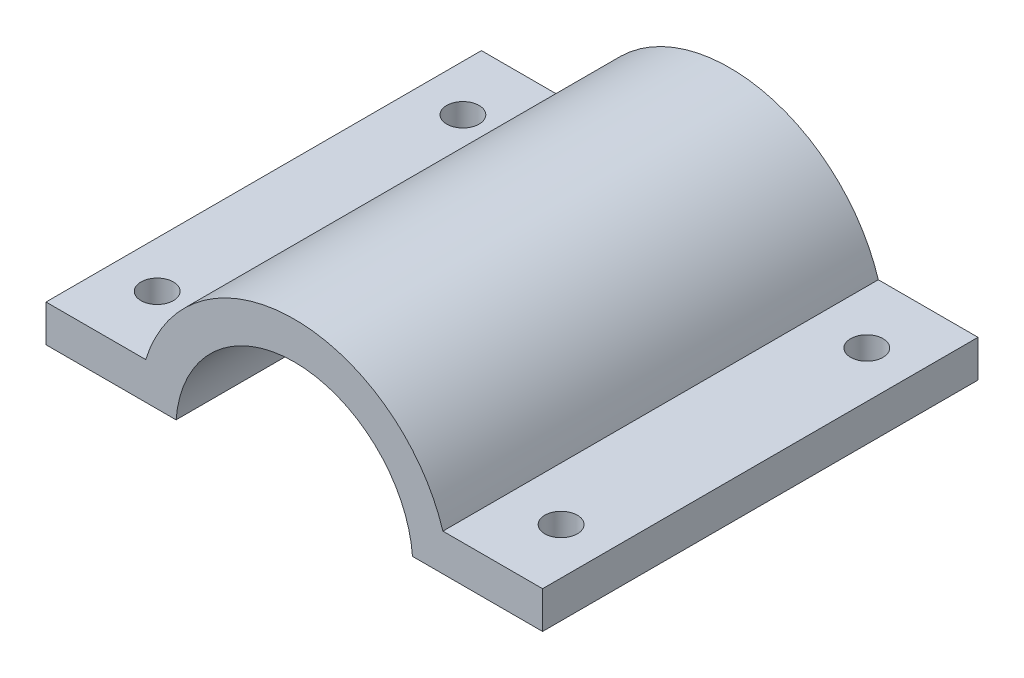
ISO-10303-21;
HEADER;
FILE_DESCRIPTION(('STEP AP214'),'2;1');
FILE_NAME('part.step','',(''),(''),'','','');
FILE_SCHEMA(('AUTOMOTIVE_DESIGN { 1 0 10303 214 1 1 1 1 }'));
ENDSEC;
DATA;
#1=APPLICATION_CONTEXT('core data for automotive mechanical design processes');
#2=APPLICATION_PROTOCOL_DEFINITION('international standard','automotive_design',2000,#1);
#3=PRODUCT_CONTEXT('',#1,'mechanical');
#4=PRODUCT('Part','Part','',(#3));
#5=PRODUCT_RELATED_PRODUCT_CATEGORY('part','',(#4));
#6=PRODUCT_DEFINITION_FORMATION('','',#4);
#7=PRODUCT_DEFINITION_CONTEXT('part definition',#1,'design');
#8=PRODUCT_DEFINITION('design','',#6,#7);
#9=PRODUCT_DEFINITION_SHAPE('','',#8);
#10=(LENGTH_UNIT() NAMED_UNIT(*) SI_UNIT(.MILLI.,.METRE.));
#11=(NAMED_UNIT(*) PLANE_ANGLE_UNIT() SI_UNIT($,.RADIAN.));
#12=(NAMED_UNIT(*) SI_UNIT($,.STERADIAN.) SOLID_ANGLE_UNIT());
#13=UNCERTAINTY_MEASURE_WITH_UNIT(LENGTH_MEASURE(1.E-05),#10,'distance_accuracy_value','');
#14=(GEOMETRIC_REPRESENTATION_CONTEXT(3) GLOBAL_UNCERTAINTY_ASSIGNED_CONTEXT((#13)) GLOBAL_UNIT_ASSIGNED_CONTEXT((#10,
#11,#12)) REPRESENTATION_CONTEXT('',''));
#15=CARTESIAN_POINT('',(0.,0.,0.));
#16=DIRECTION('',(0.,0.,1.));
#17=DIRECTION('',(1.,0.,0.));
#18=AXIS2_PLACEMENT_3D('',#15,#16,#17);
#19=CARTESIAN_POINT('',(0.,0.,47.));
#20=DIRECTION('',(0.,0.,-1.));
#21=DIRECTION('',(-1.,0.,0.));
#22=AXIS2_PLACEMENT_3D('',#19,#20,#21);
#23=CYLINDRICAL_SURFACE('',#22,12.8);
#24=CARTESIAN_POINT('',(0.,0.,0.));
#25=DIRECTION('',(0.,0.,-1.));
#26=DIRECTION('',(1.,0.,0.));
#27=AXIS2_PLACEMENT_3D('',#24,#25,#26);
#28=CIRCLE('',#27,12.8);
#29=CARTESIAN_POINT('',(-12.7608777127594,0.999999999999998,0.));
#30=VERTEX_POINT('',#29);
#31=CARTESIAN_POINT('',(12.7608777127594,0.999999999999998,0.));
#32=VERTEX_POINT('',#31);
#33=EDGE_CURVE('E139',#30,#32,#28,.T.);
#34=ORIENTED_EDGE('',*,*,#33,.T.);
#35=DIRECTION('',(0.,0.,-1.));
#36=VECTOR('',#35,1.);
#37=CARTESIAN_POINT('',(12.7608777127594,0.999999999999998,47.));
#38=LINE('',#37,#36);
#39=CARTESIAN_POINT('',(12.7608777127594,0.999999999999998,47.));
#40=VERTEX_POINT('',#39);
#41=EDGE_CURVE('E11',#40,#32,#38,.T.);
#42=ORIENTED_EDGE('',*,*,#41,.F.);
#43=CARTESIAN_POINT('',(0.,0.,47.));
#44=DIRECTION('',(0.,0.,-1.));
#45=DIRECTION('',(1.,0.,0.));
#46=AXIS2_PLACEMENT_3D('',#43,#44,#45);
#47=CIRCLE('',#46,12.8);
#48=CARTESIAN_POINT('',(-12.7608777127594,0.999999999999998,47.));
#49=VERTEX_POINT('',#48);
#50=EDGE_CURVE('E154',#49,#40,#47,.T.);
#51=ORIENTED_EDGE('',*,*,#50,.F.);
#52=DIRECTION('',(0.,0.,-1.));
#53=VECTOR('',#52,1.);
#54=CARTESIAN_POINT('',(-12.7608777127594,0.999999999999998,47.));
#55=LINE('',#54,#53);
#56=EDGE_CURVE('E135',#49,#30,#55,.T.);
#57=ORIENTED_EDGE('',*,*,#56,.T.);
#58=EDGE_LOOP('',(#34,#42,#51,#57));
#59=FACE_BOUND('',#58,.T.);
#60=ADVANCED_FACE('F43',(#59),#23,.F.);
#61=CARTESIAN_POINT('',(26.8,0.999999999999999,47.));
#62=DIRECTION('',(0.,1.,0.));
#63=DIRECTION('',(-1.,0.,0.));
#64=AXIS2_PLACEMENT_3D('',#61,#62,#63);
#65=PLANE('',#64);
#66=CARTESIAN_POINT('',(21.8,0.999999999999999,7.));
#67=DIRECTION('',(0.,1.,0.));
#68=DIRECTION('',(-1.,0.,0.));
#69=AXIS2_PLACEMENT_3D('',#66,#67,#68);
#70=CIRCLE('',#69,1.75);
#71=CARTESIAN_POINT('',(20.05,0.999999999999999,7.));
#72=VERTEX_POINT('',#71);
#73=EDGE_CURVE('E203',#72,#72,#70,.F.);
#74=ORIENTED_EDGE('',*,*,#73,.F.);
#75=EDGE_LOOP('',(#74));
#76=FACE_BOUND('',#75,.T.);
#77=CARTESIAN_POINT('',(21.8,0.999999999999999,40.));
#78=DIRECTION('',(0.,1.,0.));
#79=DIRECTION('',(-1.,0.,0.));
#80=AXIS2_PLACEMENT_3D('',#77,#78,#79);
#81=CIRCLE('',#80,1.75);
#82=CARTESIAN_POINT('',(20.05,0.999999999999999,40.));
#83=VERTEX_POINT('',#82);
#84=EDGE_CURVE('E143',#83,#83,#81,.F.);
#85=ORIENTED_EDGE('',*,*,#84,.F.);
#86=EDGE_LOOP('',(#85));
#87=FACE_BOUND('',#86,.T.);
#88=DIRECTION('',(1.,0.,0.));
#89=VECTOR('',#88,1.);
#90=CARTESIAN_POINT('',(26.8,0.999999999999999,0.));
#91=LINE('',#90,#89);
#92=CARTESIAN_POINT('',(26.8,0.999999999999999,0.));
#93=VERTEX_POINT('',#92);
#94=EDGE_CURVE('E142',#32,#93,#91,.T.);
#95=ORIENTED_EDGE('',*,*,#94,.T.);
#96=DIRECTION('',(0.,0.,-1.));
#97=VECTOR('',#96,1.);
#98=CARTESIAN_POINT('',(26.8,0.999999999999999,47.));
#99=LINE('',#98,#97);
#100=CARTESIAN_POINT('',(26.8,0.999999999999999,47.));
#101=VERTEX_POINT('',#100);
#102=EDGE_CURVE('E51',#101,#93,#99,.T.);
#103=ORIENTED_EDGE('',*,*,#102,.F.);
#104=DIRECTION('',(1.,0.,0.));
#105=VECTOR('',#104,1.);
#106=CARTESIAN_POINT('',(26.8,0.999999999999999,47.));
#107=LINE('',#106,#105);
#108=EDGE_CURVE('E102',#40,#101,#107,.T.);
#109=ORIENTED_EDGE('',*,*,#108,.F.);
#110=ORIENTED_EDGE('',*,*,#41,.T.);
#111=EDGE_LOOP('',(#95,#103,#109,#110));
#112=FACE_BOUND('',#111,.T.);
#113=ADVANCED_FACE('F213',(#76,#87,#112),#65,.F.);
#114=CARTESIAN_POINT('',(26.8,5.,47.));
#115=DIRECTION('',(-1.,0.,0.));
#116=DIRECTION('',(0.,-1.,0.));
#117=AXIS2_PLACEMENT_3D('',#114,#115,#116);
#118=PLANE('',#117);
#119=DIRECTION('',(0.,1.,0.));
#120=VECTOR('',#119,1.);
#121=CARTESIAN_POINT('',(26.8,5.,0.));
#122=LINE('',#121,#120);
#123=CARTESIAN_POINT('',(26.8,5.,0.));
#124=VERTEX_POINT('',#123);
#125=EDGE_CURVE('E145',#93,#124,#122,.T.);
#126=ORIENTED_EDGE('',*,*,#125,.T.);
#127=DIRECTION('',(0.,0.,-1.));
#128=VECTOR('',#127,1.);
#129=CARTESIAN_POINT('',(26.8,5.,47.));
#130=LINE('',#129,#128);
#131=CARTESIAN_POINT('',(26.8,5.,47.));
#132=VERTEX_POINT('',#131);
#133=EDGE_CURVE('E161',#132,#124,#130,.T.);
#134=ORIENTED_EDGE('',*,*,#133,.F.);
#135=DIRECTION('',(0.,1.,0.));
#136=VECTOR('',#135,1.);
#137=CARTESIAN_POINT('',(26.8,5.,47.));
#138=LINE('',#137,#136);
#139=EDGE_CURVE('E169',#101,#132,#138,.T.);
#140=ORIENTED_EDGE('',*,*,#139,.F.);
#141=ORIENTED_EDGE('',*,*,#102,.T.);
#142=EDGE_LOOP('',(#126,#134,#140,#141));
#143=FACE_BOUND('',#142,.T.);
#144=ADVANCED_FACE('F167',(#143),#118,.F.);
#145=CARTESIAN_POINT('',(16.0387031894726,5.,47.));
#146=DIRECTION('',(0.,-1.,0.));
#147=DIRECTION('',(1.,0.,0.));
#148=AXIS2_PLACEMENT_3D('',#145,#146,#147);
#149=PLANE('',#148);
#150=CARTESIAN_POINT('',(21.8,5.00000000000001,7.));
#151=DIRECTION('',(0.,1.,0.));
#152=DIRECTION('',(-1.,0.,0.));
#153=AXIS2_PLACEMENT_3D('',#150,#151,#152);
#154=CIRCLE('',#153,1.75);
#155=CARTESIAN_POINT('',(20.05,5.00000000000001,7.));
#156=VERTEX_POINT('',#155);
#157=EDGE_CURVE('E192',#156,#156,#154,.T.);
#158=ORIENTED_EDGE('',*,*,#157,.F.);
#159=EDGE_LOOP('',(#158));
#160=FACE_BOUND('',#159,.T.);
#161=CARTESIAN_POINT('',(21.8,5.00000000000001,40.));
#162=DIRECTION('',(0.,1.,0.));
#163=DIRECTION('',(-1.,0.,0.));
#164=AXIS2_PLACEMENT_3D('',#161,#162,#163);
#165=CIRCLE('',#164,1.75);
#166=CARTESIAN_POINT('',(20.05,5.00000000000001,40.));
#167=VERTEX_POINT('',#166);
#168=EDGE_CURVE('E189',#167,#167,#165,.T.);
#169=ORIENTED_EDGE('',*,*,#168,.F.);
#170=EDGE_LOOP('',(#169));
#171=FACE_BOUND('',#170,.T.);
#172=DIRECTION('',(-1.,0.,0.));
#173=VECTOR('',#172,1.);
#174=CARTESIAN_POINT('',(16.0387031894726,5.,0.));
#175=LINE('',#174,#173);
#176=CARTESIAN_POINT('',(16.0387031894726,5.,0.));
#177=VERTEX_POINT('',#176);
#178=EDGE_CURVE('E147',#124,#177,#175,.T.);
#179=ORIENTED_EDGE('',*,*,#178,.T.);
#180=DIRECTION('',(0.,0.,-1.));
#181=VECTOR('',#180,1.);
#182=CARTESIAN_POINT('',(16.0387031894726,5.,47.));
#183=LINE('',#182,#181);
#184=CARTESIAN_POINT('',(16.0387031894726,5.,47.));
#185=VERTEX_POINT('',#184);
#186=EDGE_CURVE('E158',#185,#177,#183,.T.);
#187=ORIENTED_EDGE('',*,*,#186,.F.);
#188=DIRECTION('',(-1.,0.,0.));
#189=VECTOR('',#188,1.);
#190=CARTESIAN_POINT('',(16.0387031894726,5.,47.));
#191=LINE('',#190,#189);
#192=EDGE_CURVE('E181',#132,#185,#191,.T.);
#193=ORIENTED_EDGE('',*,*,#192,.F.);
#194=ORIENTED_EDGE('',*,*,#133,.T.);
#195=EDGE_LOOP('',(#179,#187,#193,#194));
#196=FACE_BOUND('',#195,.T.);
#197=ADVANCED_FACE('F177',(#160,#171,#196),#149,.F.);
#198=CARTESIAN_POINT('',(0.,0.,47.));
#199=DIRECTION('',(0.,0.,-1.));
#200=DIRECTION('',(-1.,0.,0.));
#201=AXIS2_PLACEMENT_3D('',#198,#199,#200);
#202=CYLINDRICAL_SURFACE('',#201,16.8);
#203=CARTESIAN_POINT('',(0.,0.,0.));
#204=DIRECTION('',(0.,0.,1.));
#205=DIRECTION('',(-1.,0.,0.));
#206=AXIS2_PLACEMENT_3D('',#203,#204,#205);
#207=CIRCLE('',#206,16.8);
#208=CARTESIAN_POINT('',(-16.0387031894726,5.,0.));
#209=VERTEX_POINT('',#208);
#210=EDGE_CURVE('E149',#177,#209,#207,.T.);
#211=ORIENTED_EDGE('',*,*,#210,.T.);
#212=DIRECTION('',(0.,0.,-1.));
#213=VECTOR('',#212,1.);
#214=CARTESIAN_POINT('',(-16.0387031894726,5.,47.));
#215=LINE('',#214,#213);
#216=CARTESIAN_POINT('',(-16.0387031894726,5.,47.));
#217=VERTEX_POINT('',#216);
#218=EDGE_CURVE('E130',#217,#209,#215,.T.);
#219=ORIENTED_EDGE('',*,*,#218,.F.);
#220=CARTESIAN_POINT('',(0.,0.,47.));
#221=DIRECTION('',(0.,0.,1.));
#222=DIRECTION('',(-1.,0.,0.));
#223=AXIS2_PLACEMENT_3D('',#220,#221,#222);
#224=CIRCLE('',#223,16.8);
#225=EDGE_CURVE('E121',#185,#217,#224,.T.);
#226=ORIENTED_EDGE('',*,*,#225,.F.);
#227=ORIENTED_EDGE('',*,*,#186,.T.);
#228=EDGE_LOOP('',(#211,#219,#226,#227));
#229=FACE_BOUND('',#228,.T.);
#230=ADVANCED_FACE('F180',(#229),#202,.T.);
#231=CARTESIAN_POINT('',(-26.8,5.,47.));
#232=DIRECTION('',(0.,-1.,0.));
#233=DIRECTION('',(1.,0.,0.));
#234=AXIS2_PLACEMENT_3D('',#231,#232,#233);
#235=PLANE('',#234);
#236=CARTESIAN_POINT('',(-21.8,5.00000000000001,40.));
#237=DIRECTION('',(0.,1.,0.));
#238=DIRECTION('',(1.,0.,0.));
#239=AXIS2_PLACEMENT_3D('',#236,#237,#238);
#240=CIRCLE('',#239,1.75);
#241=CARTESIAN_POINT('',(-23.55,5.00000000000001,40.));
#242=VERTEX_POINT('',#241);
#243=EDGE_CURVE('E193',#242,#242,#240,.T.);
#244=ORIENTED_EDGE('',*,*,#243,.F.);
#245=EDGE_LOOP('',(#244));
#246=FACE_BOUND('',#245,.T.);
#247=CARTESIAN_POINT('',(-21.8,5.00000000000001,7.));
#248=DIRECTION('',(0.,1.,0.));
#249=DIRECTION('',(1.,0.,0.));
#250=AXIS2_PLACEMENT_3D('',#247,#248,#249);
#251=CIRCLE('',#250,1.75);
#252=CARTESIAN_POINT('',(-23.55,5.00000000000001,7.));
#253=VERTEX_POINT('',#252);
#254=EDGE_CURVE('E200',#253,#253,#251,.T.);
#255=ORIENTED_EDGE('',*,*,#254,.F.);
#256=EDGE_LOOP('',(#255));
#257=FACE_BOUND('',#256,.T.);
#258=DIRECTION('',(-1.,0.,0.));
#259=VECTOR('',#258,1.);
#260=CARTESIAN_POINT('',(-26.8,5.,0.));
#261=LINE('',#260,#259);
#262=CARTESIAN_POINT('',(-26.8,5.,0.));
#263=VERTEX_POINT('',#262);
#264=EDGE_CURVE('E129',#209,#263,#261,.T.);
#265=ORIENTED_EDGE('',*,*,#264,.T.);
#266=DIRECTION('',(0.,0.,-1.));
#267=VECTOR('',#266,1.);
#268=CARTESIAN_POINT('',(-26.8,5.,47.));
#269=LINE('',#268,#267);
#270=CARTESIAN_POINT('',(-26.8,5.,47.));
#271=VERTEX_POINT('',#270);
#272=EDGE_CURVE('E126',#271,#263,#269,.T.);
#273=ORIENTED_EDGE('',*,*,#272,.F.);
#274=DIRECTION('',(-1.,0.,0.));
#275=VECTOR('',#274,1.);
#276=CARTESIAN_POINT('',(-26.8,5.,47.));
#277=LINE('',#276,#275);
#278=EDGE_CURVE('E115',#217,#271,#277,.T.);
#279=ORIENTED_EDGE('',*,*,#278,.F.);
#280=ORIENTED_EDGE('',*,*,#218,.T.);
#281=EDGE_LOOP('',(#265,#273,#279,#280));
#282=FACE_BOUND('',#281,.T.);
#283=ADVANCED_FACE('F127',(#246,#257,#282),#235,.F.);
#284=CARTESIAN_POINT('',(-26.8,0.999999999999999,47.));
#285=DIRECTION('',(1.,0.,0.));
#286=DIRECTION('',(0.,1.,0.));
#287=AXIS2_PLACEMENT_3D('',#284,#285,#286);
#288=PLANE('',#287);
#289=DIRECTION('',(0.,-1.,0.));
#290=VECTOR('',#289,1.);
#291=CARTESIAN_POINT('',(-26.8,0.999999999999999,0.));
#292=LINE('',#291,#290);
#293=CARTESIAN_POINT('',(-26.8,0.999999999999999,0.));
#294=VERTEX_POINT('',#293);
#295=EDGE_CURVE('E88',#263,#294,#292,.T.);
#296=ORIENTED_EDGE('',*,*,#295,.T.);
#297=DIRECTION('',(0.,0.,-1.));
#298=VECTOR('',#297,1.);
#299=CARTESIAN_POINT('',(-26.8,0.999999999999999,47.));
#300=LINE('',#299,#298);
#301=CARTESIAN_POINT('',(-26.8,0.999999999999999,47.));
#302=VERTEX_POINT('',#301);
#303=EDGE_CURVE('E131',#302,#294,#300,.T.);
#304=ORIENTED_EDGE('',*,*,#303,.F.);
#305=DIRECTION('',(0.,-1.,0.));
#306=VECTOR('',#305,1.);
#307=CARTESIAN_POINT('',(-26.8,0.999999999999999,47.));
#308=LINE('',#307,#306);
#309=EDGE_CURVE('E119',#271,#302,#308,.T.);
#310=ORIENTED_EDGE('',*,*,#309,.F.);
#311=ORIENTED_EDGE('',*,*,#272,.T.);
#312=EDGE_LOOP('',(#296,#304,#310,#311));
#313=FACE_BOUND('',#312,.T.);
#314=ADVANCED_FACE('F133',(#313),#288,.F.);
#315=CARTESIAN_POINT('',(-12.7608777127594,0.999999999999998,47.));
#316=DIRECTION('',(0.,1.,0.));
#317=DIRECTION('',(-1.,0.,0.));
#318=AXIS2_PLACEMENT_3D('',#315,#316,#317);
#319=PLANE('',#318);
#320=CARTESIAN_POINT('',(-21.8,0.999999999999999,40.));
#321=DIRECTION('',(0.,1.,0.));
#322=DIRECTION('',(-1.,0.,0.));
#323=AXIS2_PLACEMENT_3D('',#320,#321,#322);
#324=CIRCLE('',#323,1.75);
#325=CARTESIAN_POINT('',(-23.55,0.999999999999999,40.));
#326=VERTEX_POINT('',#325);
#327=EDGE_CURVE('E197',#326,#326,#324,.F.);
#328=ORIENTED_EDGE('',*,*,#327,.F.);
#329=EDGE_LOOP('',(#328));
#330=FACE_BOUND('',#329,.T.);
#331=CARTESIAN_POINT('',(-21.8,0.999999999999999,7.));
#332=DIRECTION('',(0.,1.,0.));
#333=DIRECTION('',(-1.,0.,0.));
#334=AXIS2_PLACEMENT_3D('',#331,#332,#333);
#335=CIRCLE('',#334,1.75);
#336=CARTESIAN_POINT('',(-23.55,0.999999999999999,7.));
#337=VERTEX_POINT('',#336);
#338=EDGE_CURVE('E196',#337,#337,#335,.F.);
#339=ORIENTED_EDGE('',*,*,#338,.F.);
#340=EDGE_LOOP('',(#339));
#341=FACE_BOUND('',#340,.T.);
#342=DIRECTION('',(1.,0.,0.));
#343=VECTOR('',#342,1.);
#344=CARTESIAN_POINT('',(-12.7608777127594,0.999999999999998,0.));
#345=LINE('',#344,#343);
#346=EDGE_CURVE('E94',#294,#30,#345,.T.);
#347=ORIENTED_EDGE('',*,*,#346,.T.);
#348=ORIENTED_EDGE('',*,*,#56,.F.);
#349=DIRECTION('',(1.,0.,0.));
#350=VECTOR('',#349,1.);
#351=CARTESIAN_POINT('',(-12.7608777127594,0.999999999999998,47.));
#352=LINE('',#351,#350);
#353=EDGE_CURVE('E59',#302,#49,#352,.T.);
#354=ORIENTED_EDGE('',*,*,#353,.F.);
#355=ORIENTED_EDGE('',*,*,#303,.T.);
#356=EDGE_LOOP('',(#347,#348,#354,#355));
#357=FACE_BOUND('',#356,.T.);
#358=ADVANCED_FACE('F220',(#330,#341,#357),#319,.F.);
#359=CARTESIAN_POINT('',(0.,0.,47.));
#360=DIRECTION('',(0.,0.,1.));
#361=DIRECTION('',(1.,0.,0.));
#362=AXIS2_PLACEMENT_3D('',#359,#360,#361);
#363=PLANE('',#362);
#364=ORIENTED_EDGE('',*,*,#50,.T.);
#365=ORIENTED_EDGE('',*,*,#108,.T.);
#366=ORIENTED_EDGE('',*,*,#139,.T.);
#367=ORIENTED_EDGE('',*,*,#192,.T.);
#368=ORIENTED_EDGE('',*,*,#225,.T.);
#369=ORIENTED_EDGE('',*,*,#278,.T.);
#370=ORIENTED_EDGE('',*,*,#309,.T.);
#371=ORIENTED_EDGE('',*,*,#353,.T.);
#372=EDGE_LOOP('',(#364,#365,#366,#367,#368,#369,#370,#371));
#373=FACE_BOUND('',#372,.T.);
#374=ADVANCED_FACE('F117',(#373),#363,.T.);
#375=CARTESIAN_POINT('',(0.,0.,0.));
#376=DIRECTION('',(0.,0.,1.));
#377=DIRECTION('',(1.,0.,0.));
#378=AXIS2_PLACEMENT_3D('',#375,#376,#377);
#379=PLANE('',#378);
#380=ORIENTED_EDGE('',*,*,#33,.F.);
#381=ORIENTED_EDGE('',*,*,#346,.F.);
#382=ORIENTED_EDGE('',*,*,#295,.F.);
#383=ORIENTED_EDGE('',*,*,#264,.F.);
#384=ORIENTED_EDGE('',*,*,#210,.F.);
#385=ORIENTED_EDGE('',*,*,#178,.F.);
#386=ORIENTED_EDGE('',*,*,#125,.F.);
#387=ORIENTED_EDGE('',*,*,#94,.F.);
#388=EDGE_LOOP('',(#380,#381,#382,#383,#384,#385,#386,#387));
#389=FACE_BOUND('',#388,.T.);
#390=ADVANCED_FACE('F173',(#389),#379,.F.);
#391=CARTESIAN_POINT('',(-21.8,0.998999999999994,7.));
#392=DIRECTION('',(0.,1.,0.));
#393=DIRECTION('',(-1.,0.,0.));
#394=AXIS2_PLACEMENT_3D('',#391,#392,#393);
#395=CYLINDRICAL_SURFACE('',#394,1.75);
#396=CARTESIAN_POINT('',(-23.55,5.00000000000001,7.));
#397=CARTESIAN_POINT('',(-23.55,4.95833333333334,7.));
#398=CARTESIAN_POINT('',(-23.55,4.91666666666668,7.));
#399=CARTESIAN_POINT('',(-23.55,4.83333333333334,7.));
#400=CARTESIAN_POINT('',(-23.55,4.79166666666668,7.));
#401=CARTESIAN_POINT('',(-23.55,4.70833333333334,7.));
#402=CARTESIAN_POINT('',(-23.55,4.66666666666668,7.));
#403=CARTESIAN_POINT('',(-23.55,4.58333333333334,7.));
#404=CARTESIAN_POINT('',(-23.55,4.54166666666667,7.));
#405=CARTESIAN_POINT('',(-23.55,4.45833333333334,7.));
#406=CARTESIAN_POINT('',(-23.55,4.41666666666667,7.));
#407=CARTESIAN_POINT('',(-23.55,4.33333333333334,7.));
#408=CARTESIAN_POINT('',(-23.55,4.29166666666667,7.));
#409=CARTESIAN_POINT('',(-23.55,4.20833333333334,7.));
#410=CARTESIAN_POINT('',(-23.55,4.16666666666667,7.));
#411=CARTESIAN_POINT('',(-23.55,4.08333333333334,7.));
#412=CARTESIAN_POINT('',(-23.55,4.04166666666667,7.));
#413=CARTESIAN_POINT('',(-23.55,3.95833333333334,7.));
#414=CARTESIAN_POINT('',(-23.55,3.91666666666667,7.));
#415=CARTESIAN_POINT('',(-23.55,3.83333333333334,7.));
#416=CARTESIAN_POINT('',(-23.55,3.79166666666667,7.));
#417=CARTESIAN_POINT('',(-23.55,3.70833333333334,7.));
#418=CARTESIAN_POINT('',(-23.55,3.66666666666667,7.));
#419=CARTESIAN_POINT('',(-23.55,3.58333333333334,7.));
#420=CARTESIAN_POINT('',(-23.55,3.54166666666667,7.));
#421=CARTESIAN_POINT('',(-23.55,3.45833333333334,7.));
#422=CARTESIAN_POINT('',(-23.55,3.41666666666667,7.));
#423=CARTESIAN_POINT('',(-23.55,3.33333333333334,7.));
#424=CARTESIAN_POINT('',(-23.55,3.29166666666667,7.));
#425=CARTESIAN_POINT('',(-23.55,3.20833333333334,7.));
#426=CARTESIAN_POINT('',(-23.55,3.16666666666667,7.));
#427=CARTESIAN_POINT('',(-23.55,3.08333333333334,7.));
#428=CARTESIAN_POINT('',(-23.55,3.04166666666667,7.));
#429=CARTESIAN_POINT('',(-23.55,2.95833333333334,7.));
#430=CARTESIAN_POINT('',(-23.55,2.91666666666667,7.));
#431=CARTESIAN_POINT('',(-23.55,2.83333333333334,7.));
#432=CARTESIAN_POINT('',(-23.55,2.79166666666667,7.));
#433=CARTESIAN_POINT('',(-23.55,2.70833333333334,7.));
#434=CARTESIAN_POINT('',(-23.55,2.66666666666667,7.));
#435=CARTESIAN_POINT('',(-23.55,2.58333333333334,7.));
#436=CARTESIAN_POINT('',(-23.55,2.54166666666667,7.));
#437=CARTESIAN_POINT('',(-23.55,2.45833333333334,7.));
#438=CARTESIAN_POINT('',(-23.55,2.41666666666667,7.));
#439=CARTESIAN_POINT('',(-23.55,2.33333333333334,7.));
#440=CARTESIAN_POINT('',(-23.55,2.29166666666667,7.));
#441=CARTESIAN_POINT('',(-23.55,2.20833333333334,7.));
#442=CARTESIAN_POINT('',(-23.55,2.16666666666667,7.));
#443=CARTESIAN_POINT('',(-23.55,2.08333333333334,7.));
#444=CARTESIAN_POINT('',(-23.55,2.04166666666667,7.));
#445=CARTESIAN_POINT('',(-23.55,1.95833333333333,7.));
#446=CARTESIAN_POINT('',(-23.55,1.91666666666667,7.));
#447=CARTESIAN_POINT('',(-23.55,1.83333333333333,7.));
#448=CARTESIAN_POINT('',(-23.55,1.79166666666667,7.));
#449=CARTESIAN_POINT('',(-23.55,1.70833333333333,7.));
#450=CARTESIAN_POINT('',(-23.55,1.66666666666667,7.));
#451=CARTESIAN_POINT('',(-23.55,1.58333333333333,7.));
#452=CARTESIAN_POINT('',(-23.55,1.54166666666667,7.));
#453=CARTESIAN_POINT('',(-23.55,1.45833333333333,7.));
#454=CARTESIAN_POINT('',(-23.55,1.41666666666667,7.));
#455=CARTESIAN_POINT('',(-23.55,1.33333333333333,7.));
#456=CARTESIAN_POINT('',(-23.55,1.29166666666667,7.));
#457=CARTESIAN_POINT('',(-23.55,1.20833333333333,7.));
#458=CARTESIAN_POINT('',(-23.55,1.16666666666667,7.));
#459=CARTESIAN_POINT('',(-23.55,1.08333333333333,7.));
#460=CARTESIAN_POINT('',(-23.55,1.04166666666667,7.));
#461=CARTESIAN_POINT('',(-23.55,0.999999999999999,7.));
#462=B_SPLINE_CURVE_WITH_KNOTS('',3,(#396,#397,#398,#399,#400,#401,#402,#403,#404,#405,#406,
#407,#408,#409,#410,#411,#412,#413,#414,#415,#416,#417,#418,#419,#420,#421,#422,#423,#424,#425,
#426,#427,#428,#429,#430,#431,#432,#433,#434,#435,#436,#437,#438,#439,#440,#441,#442,#443,#444,
#445,#446,#447,#448,#449,#450,#451,#452,#453,#454,#455,#456,#457,#458,#459,#460,#461),
.UNSPECIFIED.,.F.,.F.,(4,2,2,2,2,2,2,2,2,2,2,2,2,2,2,2,2,2,2,2,2,2,2,2,2,2,2,2,2,2,2,2,4),(0.,
0.125,0.25,0.375000000000001,0.500000000000001,0.625000000000001,0.750000000000002,
0.875000000000003,1.,1.125,1.25,1.375,1.5,1.625,1.75000000000001,1.87500000000001,
2.00000000000001,2.12500000000001,2.25000000000001,2.37500000000001,2.50000000000001,
2.62500000000001,2.75000000000001,2.87500000000001,3.00000000000001,3.12500000000001,
3.25000000000001,3.37500000000001,3.50000000000001,3.62500000000001,3.75000000000001,
3.87500000000001,4.00000000000001),.UNSPECIFIED.);
#463=EDGE_CURVE('BSEAM271',#253,#337,#462,.T.);
#464=ORIENTED_EDGE('',*,*,#254,.T.);
#465=ORIENTED_EDGE('',*,*,#338,.T.);
#466=ORIENTED_EDGE('',*,*,#463,.T.);
#467=ORIENTED_EDGE('',*,*,#463,.F.);
#468=EDGE_LOOP('',(#464,#466,#465,#467));
#469=FACE_BOUND('',#468,.T.);
#470=ADVANCED_FACE('F271',(#469),#395,.F.);
#471=CARTESIAN_POINT('',(-21.8,0.998999999999994,40.));
#472=DIRECTION('',(0.,1.,0.));
#473=DIRECTION('',(-1.,0.,0.));
#474=AXIS2_PLACEMENT_3D('',#471,#472,#473);
#475=CYLINDRICAL_SURFACE('',#474,1.75);
#476=CARTESIAN_POINT('',(-23.55,5.00000000000001,40.));
#477=CARTESIAN_POINT('',(-23.55,4.95833333333334,40.));
#478=CARTESIAN_POINT('',(-23.55,4.91666666666668,40.));
#479=CARTESIAN_POINT('',(-23.55,4.83333333333334,40.));
#480=CARTESIAN_POINT('',(-23.55,4.79166666666668,40.));
#481=CARTESIAN_POINT('',(-23.55,4.70833333333334,40.));
#482=CARTESIAN_POINT('',(-23.55,4.66666666666668,40.));
#483=CARTESIAN_POINT('',(-23.55,4.58333333333334,40.));
#484=CARTESIAN_POINT('',(-23.55,4.54166666666667,40.));
#485=CARTESIAN_POINT('',(-23.55,4.45833333333334,40.));
#486=CARTESIAN_POINT('',(-23.55,4.41666666666667,40.));
#487=CARTESIAN_POINT('',(-23.55,4.33333333333334,40.));
#488=CARTESIAN_POINT('',(-23.55,4.29166666666667,40.));
#489=CARTESIAN_POINT('',(-23.55,4.20833333333334,40.));
#490=CARTESIAN_POINT('',(-23.55,4.16666666666667,40.));
#491=CARTESIAN_POINT('',(-23.55,4.08333333333334,40.));
#492=CARTESIAN_POINT('',(-23.55,4.04166666666667,40.));
#493=CARTESIAN_POINT('',(-23.55,3.95833333333334,40.));
#494=CARTESIAN_POINT('',(-23.55,3.91666666666667,40.));
#495=CARTESIAN_POINT('',(-23.55,3.83333333333334,40.));
#496=CARTESIAN_POINT('',(-23.55,3.79166666666667,40.));
#497=CARTESIAN_POINT('',(-23.55,3.70833333333334,40.));
#498=CARTESIAN_POINT('',(-23.55,3.66666666666667,40.));
#499=CARTESIAN_POINT('',(-23.55,3.58333333333334,40.));
#500=CARTESIAN_POINT('',(-23.55,3.54166666666667,40.));
#501=CARTESIAN_POINT('',(-23.55,3.45833333333334,40.));
#502=CARTESIAN_POINT('',(-23.55,3.41666666666667,40.));
#503=CARTESIAN_POINT('',(-23.55,3.33333333333334,40.));
#504=CARTESIAN_POINT('',(-23.55,3.29166666666667,40.));
#505=CARTESIAN_POINT('',(-23.55,3.20833333333334,40.));
#506=CARTESIAN_POINT('',(-23.55,3.16666666666667,40.));
#507=CARTESIAN_POINT('',(-23.55,3.08333333333334,40.));
#508=CARTESIAN_POINT('',(-23.55,3.04166666666667,40.));
#509=CARTESIAN_POINT('',(-23.55,2.95833333333334,40.));
#510=CARTESIAN_POINT('',(-23.55,2.91666666666667,40.));
#511=CARTESIAN_POINT('',(-23.55,2.83333333333334,40.));
#512=CARTESIAN_POINT('',(-23.55,2.79166666666667,40.));
#513=CARTESIAN_POINT('',(-23.55,2.70833333333334,40.));
#514=CARTESIAN_POINT('',(-23.55,2.66666666666667,40.));
#515=CARTESIAN_POINT('',(-23.55,2.58333333333334,40.));
#516=CARTESIAN_POINT('',(-23.55,2.54166666666667,40.));
#517=CARTESIAN_POINT('',(-23.55,2.45833333333334,40.));
#518=CARTESIAN_POINT('',(-23.55,2.41666666666667,40.));
#519=CARTESIAN_POINT('',(-23.55,2.33333333333334,40.));
#520=CARTESIAN_POINT('',(-23.55,2.29166666666667,40.));
#521=CARTESIAN_POINT('',(-23.55,2.20833333333334,40.));
#522=CARTESIAN_POINT('',(-23.55,2.16666666666667,40.));
#523=CARTESIAN_POINT('',(-23.55,2.08333333333334,40.));
#524=CARTESIAN_POINT('',(-23.55,2.04166666666667,40.));
#525=CARTESIAN_POINT('',(-23.55,1.95833333333333,40.));
#526=CARTESIAN_POINT('',(-23.55,1.91666666666667,40.));
#527=CARTESIAN_POINT('',(-23.55,1.83333333333333,40.));
#528=CARTESIAN_POINT('',(-23.55,1.79166666666667,40.));
#529=CARTESIAN_POINT('',(-23.55,1.70833333333333,40.));
#530=CARTESIAN_POINT('',(-23.55,1.66666666666667,40.));
#531=CARTESIAN_POINT('',(-23.55,1.58333333333333,40.));
#532=CARTESIAN_POINT('',(-23.55,1.54166666666667,40.));
#533=CARTESIAN_POINT('',(-23.55,1.45833333333333,40.));
#534=CARTESIAN_POINT('',(-23.55,1.41666666666667,40.));
#535=CARTESIAN_POINT('',(-23.55,1.33333333333333,40.));
#536=CARTESIAN_POINT('',(-23.55,1.29166666666667,40.));
#537=CARTESIAN_POINT('',(-23.55,1.20833333333333,40.));
#538=CARTESIAN_POINT('',(-23.55,1.16666666666667,40.));
#539=CARTESIAN_POINT('',(-23.55,1.08333333333333,40.));
#540=CARTESIAN_POINT('',(-23.55,1.04166666666667,40.));
#541=CARTESIAN_POINT('',(-23.55,0.999999999999999,40.));
#542=B_SPLINE_CURVE_WITH_KNOTS('',3,(#476,#477,#478,#479,#480,#481,#482,#483,#484,#485,#486,
#487,#488,#489,#490,#491,#492,#493,#494,#495,#496,#497,#498,#499,#500,#501,#502,#503,#504,#505,
#506,#507,#508,#509,#510,#511,#512,#513,#514,#515,#516,#517,#518,#519,#520,#521,#522,#523,#524,
#525,#526,#527,#528,#529,#530,#531,#532,#533,#534,#535,#536,#537,#538,#539,#540,#541),
.UNSPECIFIED.,.F.,.F.,(4,2,2,2,2,2,2,2,2,2,2,2,2,2,2,2,2,2,2,2,2,2,2,2,2,2,2,2,2,2,2,2,4),(0.,
0.125,0.25,0.375000000000001,0.500000000000001,0.625000000000001,0.750000000000002,
0.875000000000003,1.,1.125,1.25,1.375,1.5,1.625,1.75000000000001,1.87500000000001,
2.00000000000001,2.12500000000001,2.25000000000001,2.37500000000001,2.50000000000001,
2.62500000000001,2.75000000000001,2.87500000000001,3.00000000000001,3.12500000000001,
3.25000000000001,3.37500000000001,3.50000000000001,3.62500000000001,3.75000000000001,
3.87500000000001,4.00000000000001),.UNSPECIFIED.);
#543=EDGE_CURVE('BSEAM305',#242,#326,#542,.T.);
#544=ORIENTED_EDGE('',*,*,#243,.T.);
#545=ORIENTED_EDGE('',*,*,#327,.T.);
#546=ORIENTED_EDGE('',*,*,#543,.T.);
#547=ORIENTED_EDGE('',*,*,#543,.F.);
#548=EDGE_LOOP('',(#544,#546,#545,#547));
#549=FACE_BOUND('',#548,.T.);
#550=ADVANCED_FACE('F305',(#549),#475,.F.);
#551=CARTESIAN_POINT('',(21.8,0.998999999999997,40.));
#552=DIRECTION('',(0.,1.,0.));
#553=DIRECTION('',(-1.,0.,0.));
#554=AXIS2_PLACEMENT_3D('',#551,#552,#553);
#555=CYLINDRICAL_SURFACE('',#554,1.75);
#556=CARTESIAN_POINT('',(20.05,5.00000000000001,40.));
#557=CARTESIAN_POINT('',(20.05,4.95833333333335,40.));
#558=CARTESIAN_POINT('',(20.05,4.91666666666668,40.));
#559=CARTESIAN_POINT('',(20.05,4.83333333333335,40.));
#560=CARTESIAN_POINT('',(20.05,4.79166666666668,40.));
#561=CARTESIAN_POINT('',(20.05,4.70833333333335,40.));
#562=CARTESIAN_POINT('',(20.05,4.66666666666668,40.));
#563=CARTESIAN_POINT('',(20.05,4.58333333333334,40.));
#564=CARTESIAN_POINT('',(20.05,4.54166666666668,40.));
#565=CARTESIAN_POINT('',(20.05,4.45833333333334,40.));
#566=CARTESIAN_POINT('',(20.05,4.41666666666668,40.));
#567=CARTESIAN_POINT('',(20.05,4.33333333333334,40.));
#568=CARTESIAN_POINT('',(20.05,4.29166666666668,40.));
#569=CARTESIAN_POINT('',(20.05,4.20833333333334,40.));
#570=CARTESIAN_POINT('',(20.05,4.16666666666668,40.));
#571=CARTESIAN_POINT('',(20.05,4.08333333333334,40.));
#572=CARTESIAN_POINT('',(20.05,4.04166666666668,40.));
#573=CARTESIAN_POINT('',(20.05,3.95833333333334,40.));
#574=CARTESIAN_POINT('',(20.05,3.91666666666668,40.));
#575=CARTESIAN_POINT('',(20.05,3.83333333333334,40.));
#576=CARTESIAN_POINT('',(20.05,3.79166666666668,40.));
#577=CARTESIAN_POINT('',(20.05,3.70833333333334,40.));
#578=CARTESIAN_POINT('',(20.05,3.66666666666667,40.));
#579=CARTESIAN_POINT('',(20.05,3.58333333333334,40.));
#580=CARTESIAN_POINT('',(20.05,3.54166666666667,40.));
#581=CARTESIAN_POINT('',(20.05,3.45833333333334,40.));
#582=CARTESIAN_POINT('',(20.05,3.41666666666667,40.));
#583=CARTESIAN_POINT('',(20.05,3.33333333333334,40.));
#584=CARTESIAN_POINT('',(20.05,3.29166666666667,40.));
#585=CARTESIAN_POINT('',(20.05,3.20833333333334,40.));
#586=CARTESIAN_POINT('',(20.05,3.16666666666667,40.));
#587=CARTESIAN_POINT('',(20.05,3.08333333333334,40.));
#588=CARTESIAN_POINT('',(20.05,3.04166666666667,40.));
#589=CARTESIAN_POINT('',(20.05,2.95833333333334,40.));
#590=CARTESIAN_POINT('',(20.05,2.91666666666667,40.));
#591=CARTESIAN_POINT('',(20.05,2.83333333333334,40.));
#592=CARTESIAN_POINT('',(20.05,2.79166666666667,40.));
#593=CARTESIAN_POINT('',(20.05,2.70833333333334,40.));
#594=CARTESIAN_POINT('',(20.05,2.66666666666667,40.));
#595=CARTESIAN_POINT('',(20.05,2.58333333333334,40.));
#596=CARTESIAN_POINT('',(20.05,2.54166666666667,40.));
#597=CARTESIAN_POINT('',(20.05,2.45833333333334,40.));
#598=CARTESIAN_POINT('',(20.05,2.41666666666667,40.));
#599=CARTESIAN_POINT('',(20.05,2.33333333333334,40.));
#600=CARTESIAN_POINT('',(20.05,2.29166666666667,40.));
#601=CARTESIAN_POINT('',(20.05,2.20833333333334,40.));
#602=CARTESIAN_POINT('',(20.05,2.16666666666667,40.));
#603=CARTESIAN_POINT('',(20.05,2.08333333333334,40.));
#604=CARTESIAN_POINT('',(20.05,2.04166666666667,40.));
#605=CARTESIAN_POINT('',(20.05,1.95833333333334,40.));
#606=CARTESIAN_POINT('',(20.05,1.91666666666667,40.));
#607=CARTESIAN_POINT('',(20.05,1.83333333333333,40.));
#608=CARTESIAN_POINT('',(20.05,1.79166666666667,40.));
#609=CARTESIAN_POINT('',(20.05,1.70833333333333,40.));
#610=CARTESIAN_POINT('',(20.05,1.66666666666667,40.));
#611=CARTESIAN_POINT('',(20.05,1.58333333333333,40.));
#612=CARTESIAN_POINT('',(20.05,1.54166666666667,40.));
#613=CARTESIAN_POINT('',(20.05,1.45833333333333,40.));
#614=CARTESIAN_POINT('',(20.05,1.41666666666667,40.));
#615=CARTESIAN_POINT('',(20.05,1.33333333333333,40.));
#616=CARTESIAN_POINT('',(20.05,1.29166666666667,40.));
#617=CARTESIAN_POINT('',(20.05,1.20833333333333,40.));
#618=CARTESIAN_POINT('',(20.05,1.16666666666667,40.));
#619=CARTESIAN_POINT('',(20.05,1.08333333333333,40.));
#620=CARTESIAN_POINT('',(20.05,1.04166666666666,40.));
#621=CARTESIAN_POINT('',(20.05,0.999999999999998,40.));
#622=B_SPLINE_CURVE_WITH_KNOTS('',3,(#556,#557,#558,#559,#560,#561,#562,#563,#564,#565,#566,
#567,#568,#569,#570,#571,#572,#573,#574,#575,#576,#577,#578,#579,#580,#581,#582,#583,#584,#585,
#586,#587,#588,#589,#590,#591,#592,#593,#594,#595,#596,#597,#598,#599,#600,#601,#602,#603,#604,
#605,#606,#607,#608,#609,#610,#611,#612,#613,#614,#615,#616,#617,#618,#619,#620,#621),
.UNSPECIFIED.,.F.,.F.,(4,2,2,2,2,2,2,2,2,2,2,2,2,2,2,2,2,2,2,2,2,2,2,2,2,2,2,2,2,2,2,2,4),(0.,
0.125,0.250000000000001,0.375000000000001,0.500000000000002,0.625000000000002,0.750000000000002,
0.875000000000003,1.,1.125,1.25,1.37500000000001,1.50000000000001,1.62500000000001,
1.75000000000001,1.87500000000001,2.00000000000001,2.12500000000001,2.25000000000001,
2.37500000000001,2.50000000000001,2.62500000000001,2.75000000000001,2.87500000000001,
3.00000000000001,3.12500000000001,3.25000000000001,3.37500000000001,3.50000000000001,
3.62500000000001,3.75000000000001,3.87500000000001,4.00000000000002),.UNSPECIFIED.);
#623=EDGE_CURVE('BSEAM314',#167,#83,#622,.T.);
#624=ORIENTED_EDGE('',*,*,#168,.T.);
#625=ORIENTED_EDGE('',*,*,#84,.T.);
#626=ORIENTED_EDGE('',*,*,#623,.T.);
#627=ORIENTED_EDGE('',*,*,#623,.F.);
#628=EDGE_LOOP('',(#624,#626,#625,#627));
#629=FACE_BOUND('',#628,.T.);
#630=ADVANCED_FACE('F314',(#629),#555,.F.);
#631=CARTESIAN_POINT('',(21.8,0.998999999999997,7.));
#632=DIRECTION('',(0.,1.,0.));
#633=DIRECTION('',(-1.,0.,0.));
#634=AXIS2_PLACEMENT_3D('',#631,#632,#633);
#635=CYLINDRICAL_SURFACE('',#634,1.75);
#636=CARTESIAN_POINT('',(20.05,5.00000000000001,7.));
#637=CARTESIAN_POINT('',(20.05,4.95833333333335,7.));
#638=CARTESIAN_POINT('',(20.05,4.91666666666668,7.));
#639=CARTESIAN_POINT('',(20.05,4.83333333333335,7.));
#640=CARTESIAN_POINT('',(20.05,4.79166666666668,7.));
#641=CARTESIAN_POINT('',(20.05,4.70833333333335,7.));
#642=CARTESIAN_POINT('',(20.05,4.66666666666668,7.));
#643=CARTESIAN_POINT('',(20.05,4.58333333333334,7.));
#644=CARTESIAN_POINT('',(20.05,4.54166666666668,7.));
#645=CARTESIAN_POINT('',(20.05,4.45833333333334,7.));
#646=CARTESIAN_POINT('',(20.05,4.41666666666668,7.));
#647=CARTESIAN_POINT('',(20.05,4.33333333333334,7.));
#648=CARTESIAN_POINT('',(20.05,4.29166666666668,7.));
#649=CARTESIAN_POINT('',(20.05,4.20833333333334,7.));
#650=CARTESIAN_POINT('',(20.05,4.16666666666668,7.));
#651=CARTESIAN_POINT('',(20.05,4.08333333333334,7.));
#652=CARTESIAN_POINT('',(20.05,4.04166666666668,7.));
#653=CARTESIAN_POINT('',(20.05,3.95833333333334,7.));
#654=CARTESIAN_POINT('',(20.05,3.91666666666668,7.));
#655=CARTESIAN_POINT('',(20.05,3.83333333333334,7.));
#656=CARTESIAN_POINT('',(20.05,3.79166666666668,7.));
#657=CARTESIAN_POINT('',(20.05,3.70833333333334,7.));
#658=CARTESIAN_POINT('',(20.05,3.66666666666667,7.));
#659=CARTESIAN_POINT('',(20.05,3.58333333333334,7.));
#660=CARTESIAN_POINT('',(20.05,3.54166666666667,7.));
#661=CARTESIAN_POINT('',(20.05,3.45833333333334,7.));
#662=CARTESIAN_POINT('',(20.05,3.41666666666667,7.));
#663=CARTESIAN_POINT('',(20.05,3.33333333333334,7.));
#664=CARTESIAN_POINT('',(20.05,3.29166666666667,7.));
#665=CARTESIAN_POINT('',(20.05,3.20833333333334,7.));
#666=CARTESIAN_POINT('',(20.05,3.16666666666667,7.));
#667=CARTESIAN_POINT('',(20.05,3.08333333333334,7.));
#668=CARTESIAN_POINT('',(20.05,3.04166666666667,7.));
#669=CARTESIAN_POINT('',(20.05,2.95833333333334,7.));
#670=CARTESIAN_POINT('',(20.05,2.91666666666667,7.));
#671=CARTESIAN_POINT('',(20.05,2.83333333333334,7.));
#672=CARTESIAN_POINT('',(20.05,2.79166666666667,7.));
#673=CARTESIAN_POINT('',(20.05,2.70833333333334,7.));
#674=CARTESIAN_POINT('',(20.05,2.66666666666667,7.));
#675=CARTESIAN_POINT('',(20.05,2.58333333333334,7.));
#676=CARTESIAN_POINT('',(20.05,2.54166666666667,7.));
#677=CARTESIAN_POINT('',(20.05,2.45833333333334,7.));
#678=CARTESIAN_POINT('',(20.05,2.41666666666667,7.));
#679=CARTESIAN_POINT('',(20.05,2.33333333333334,7.));
#680=CARTESIAN_POINT('',(20.05,2.29166666666667,7.));
#681=CARTESIAN_POINT('',(20.05,2.20833333333334,7.));
#682=CARTESIAN_POINT('',(20.05,2.16666666666667,7.));
#683=CARTESIAN_POINT('',(20.05,2.08333333333334,7.));
#684=CARTESIAN_POINT('',(20.05,2.04166666666667,7.));
#685=CARTESIAN_POINT('',(20.05,1.95833333333334,7.));
#686=CARTESIAN_POINT('',(20.05,1.91666666666667,7.));
#687=CARTESIAN_POINT('',(20.05,1.83333333333333,7.));
#688=CARTESIAN_POINT('',(20.05,1.79166666666667,7.));
#689=CARTESIAN_POINT('',(20.05,1.70833333333333,7.));
#690=CARTESIAN_POINT('',(20.05,1.66666666666667,7.));
#691=CARTESIAN_POINT('',(20.05,1.58333333333333,7.));
#692=CARTESIAN_POINT('',(20.05,1.54166666666667,7.));
#693=CARTESIAN_POINT('',(20.05,1.45833333333333,7.));
#694=CARTESIAN_POINT('',(20.05,1.41666666666667,7.));
#695=CARTESIAN_POINT('',(20.05,1.33333333333333,7.));
#696=CARTESIAN_POINT('',(20.05,1.29166666666667,7.));
#697=CARTESIAN_POINT('',(20.05,1.20833333333333,7.));
#698=CARTESIAN_POINT('',(20.05,1.16666666666667,7.));
#699=CARTESIAN_POINT('',(20.05,1.08333333333333,7.));
#700=CARTESIAN_POINT('',(20.05,1.04166666666666,7.));
#701=CARTESIAN_POINT('',(20.05,0.999999999999998,7.));
#702=B_SPLINE_CURVE_WITH_KNOTS('',3,(#636,#637,#638,#639,#640,#641,#642,#643,#644,#645,#646,
#647,#648,#649,#650,#651,#652,#653,#654,#655,#656,#657,#658,#659,#660,#661,#662,#663,#664,#665,
#666,#667,#668,#669,#670,#671,#672,#673,#674,#675,#676,#677,#678,#679,#680,#681,#682,#683,#684,
#685,#686,#687,#688,#689,#690,#691,#692,#693,#694,#695,#696,#697,#698,#699,#700,#701),
.UNSPECIFIED.,.F.,.F.,(4,2,2,2,2,2,2,2,2,2,2,2,2,2,2,2,2,2,2,2,2,2,2,2,2,2,2,2,2,2,2,2,4),(0.,
0.125,0.250000000000001,0.375000000000001,0.500000000000002,0.625000000000002,0.750000000000002,
0.875000000000003,1.,1.125,1.25,1.37500000000001,1.50000000000001,1.62500000000001,
1.75000000000001,1.87500000000001,2.00000000000001,2.12500000000001,2.25000000000001,
2.37500000000001,2.50000000000001,2.62500000000001,2.75000000000001,2.87500000000001,
3.00000000000001,3.12500000000001,3.25000000000001,3.37500000000001,3.50000000000001,
3.62500000000001,3.75000000000001,3.87500000000001,4.00000000000002),.UNSPECIFIED.);
#703=EDGE_CURVE('BSEAM211',#156,#72,#702,.T.);
#704=ORIENTED_EDGE('',*,*,#157,.T.);
#705=ORIENTED_EDGE('',*,*,#73,.T.);
#706=ORIENTED_EDGE('',*,*,#703,.T.);
#707=ORIENTED_EDGE('',*,*,#703,.F.);
#708=EDGE_LOOP('',(#704,#706,#705,#707));
#709=FACE_BOUND('',#708,.T.);
#710=ADVANCED_FACE('F211',(#709),#635,.F.);
#711=CLOSED_SHELL('',(#60,#113,#144,#197,#230,#283,#314,#358,#374,#390,#470,#550,#630,#710));
#712=MANIFOLD_SOLID_BREP('B2',#711);
#713=ADVANCED_BREP_SHAPE_REPRESENTATION('',(#18,#712),#14);
#714=SHAPE_DEFINITION_REPRESENTATION(#9,#713);
ENDSEC;
END-ISO-10303-21;
